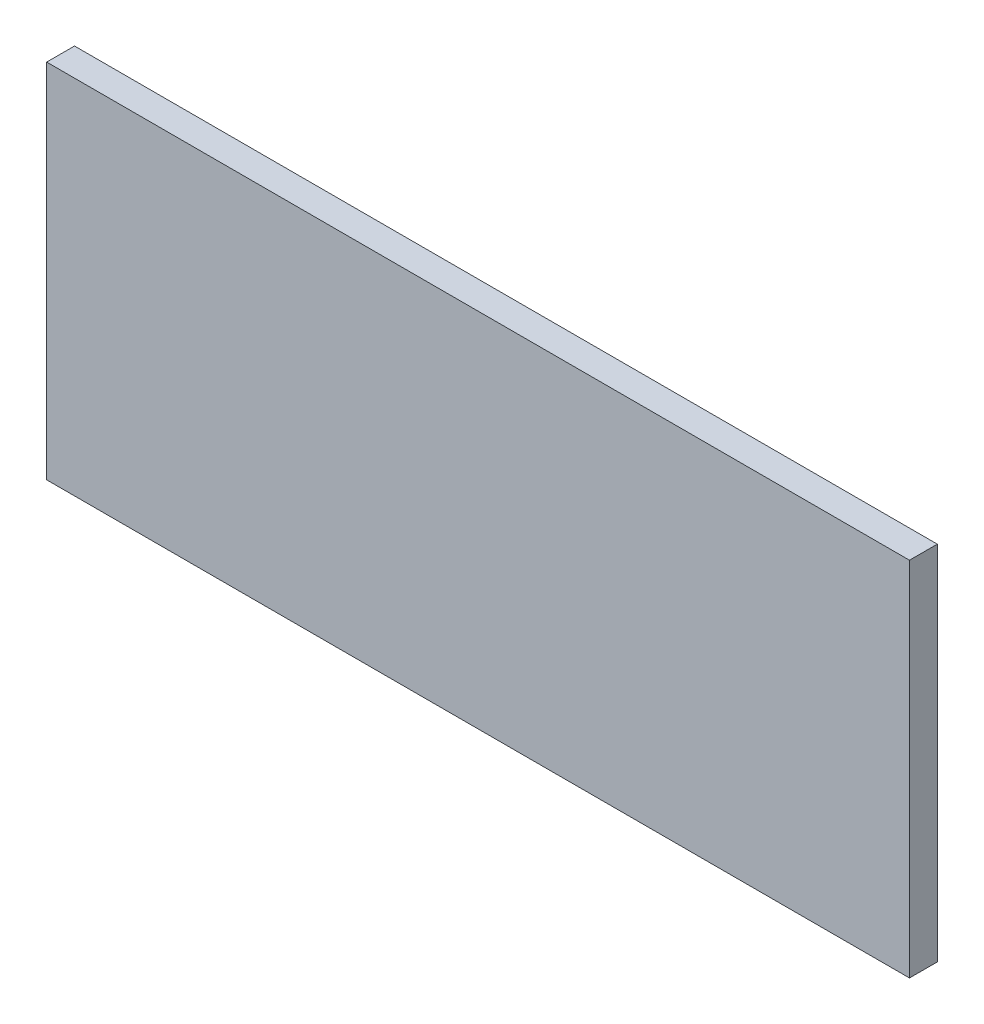
ISO-10303-21;
HEADER;
FILE_DESCRIPTION(('STEP AP214'),'2;1');
FILE_NAME('part.step','',(''),(''),'','','');
FILE_SCHEMA(('AUTOMOTIVE_DESIGN { 1 0 10303 214 1 1 1 1 }'));
ENDSEC;
DATA;
#1=APPLICATION_CONTEXT('core data for automotive mechanical design processes');
#2=APPLICATION_PROTOCOL_DEFINITION('international standard','automotive_design',2000,#1);
#3=PRODUCT_CONTEXT('',#1,'mechanical');
#4=PRODUCT('Part','Part','',(#3));
#5=PRODUCT_RELATED_PRODUCT_CATEGORY('part','',(#4));
#6=PRODUCT_DEFINITION_FORMATION('','',#4);
#7=PRODUCT_DEFINITION_CONTEXT('part definition',#1,'design');
#8=PRODUCT_DEFINITION('design','',#6,#7);
#9=PRODUCT_DEFINITION_SHAPE('','',#8);
#10=(LENGTH_UNIT() NAMED_UNIT(*) SI_UNIT(.MILLI.,.METRE.));
#11=(NAMED_UNIT(*) PLANE_ANGLE_UNIT() SI_UNIT($,.RADIAN.));
#12=(NAMED_UNIT(*) SI_UNIT($,.STERADIAN.) SOLID_ANGLE_UNIT());
#13=UNCERTAINTY_MEASURE_WITH_UNIT(LENGTH_MEASURE(1.E-05),#10,'distance_accuracy_value','');
#14=(GEOMETRIC_REPRESENTATION_CONTEXT(3) GLOBAL_UNCERTAINTY_ASSIGNED_CONTEXT((#13)) GLOBAL_UNIT_ASSIGNED_CONTEXT((#10,
#11,#12)) REPRESENTATION_CONTEXT('',''));
#15=CARTESIAN_POINT('',(0.,0.,0.));
#16=DIRECTION('',(0.,0.,1.));
#17=DIRECTION('',(1.,0.,0.));
#18=AXIS2_PLACEMENT_3D('',#15,#16,#17);
#19=CARTESIAN_POINT('',(310.,-130.,20.));
#20=DIRECTION('',(-1.,0.,0.));
#21=DIRECTION('',(0.,0.,1.));
#22=AXIS2_PLACEMENT_3D('',#19,#20,#21);
#23=PLANE('',#22);
#24=DIRECTION('',(0.,1.,0.));
#25=VECTOR('',#24,1.);
#26=CARTESIAN_POINT('',(310.,-130.,0.));
#27=LINE('',#26,#25);
#28=CARTESIAN_POINT('',(310.,-130.,0.));
#29=VERTEX_POINT('',#28);
#30=CARTESIAN_POINT('',(310.,130.,0.));
#31=VERTEX_POINT('',#30);
#32=EDGE_CURVE('E113',#29,#31,#27,.T.);
#33=ORIENTED_EDGE('',*,*,#32,.T.);
#34=DIRECTION('',(0.,0.,-1.));
#35=VECTOR('',#34,1.);
#36=CARTESIAN_POINT('',(310.,130.,20.));
#37=LINE('',#36,#35);
#38=CARTESIAN_POINT('',(310.,130.,20.));
#39=VERTEX_POINT('',#38);
#40=EDGE_CURVE('E11',#39,#31,#37,.T.);
#41=ORIENTED_EDGE('',*,*,#40,.F.);
#42=DIRECTION('',(0.,1.,0.));
#43=VECTOR('',#42,1.);
#44=CARTESIAN_POINT('',(310.,-130.,20.));
#45=LINE('',#44,#43);
#46=CARTESIAN_POINT('',(310.,-130.,20.));
#47=VERTEX_POINT('',#46);
#48=EDGE_CURVE('E97',#47,#39,#45,.T.);
#49=ORIENTED_EDGE('',*,*,#48,.F.);
#50=DIRECTION('',(0.,0.,-1.));
#51=VECTOR('',#50,1.);
#52=CARTESIAN_POINT('',(310.,-130.,20.));
#53=LINE('',#52,#51);
#54=EDGE_CURVE('E109',#47,#29,#53,.T.);
#55=ORIENTED_EDGE('',*,*,#54,.T.);
#56=EDGE_LOOP('',(#33,#41,#49,#55));
#57=FACE_BOUND('',#56,.T.);
#58=ADVANCED_FACE('F45',(#57),#23,.F.);
#59=CARTESIAN_POINT('',(-310.,130.,20.));
#60=DIRECTION('',(0.,-1.,0.));
#61=DIRECTION('',(0.,0.,-1.));
#62=AXIS2_PLACEMENT_3D('',#59,#60,#61);
#63=PLANE('',#62);
#64=DIRECTION('',(-1.,0.,0.));
#65=VECTOR('',#64,1.);
#66=CARTESIAN_POINT('',(-310.,130.,0.));
#67=LINE('',#66,#65);
#68=CARTESIAN_POINT('',(-310.,130.,0.));
#69=VERTEX_POINT('',#68);
#70=EDGE_CURVE('E102',#31,#69,#67,.T.);
#71=ORIENTED_EDGE('',*,*,#70,.T.);
#72=DIRECTION('',(0.,0.,-1.));
#73=VECTOR('',#72,1.);
#74=CARTESIAN_POINT('',(-310.,130.,20.));
#75=LINE('',#74,#73);
#76=CARTESIAN_POINT('',(-310.,130.,20.));
#77=VERTEX_POINT('',#76);
#78=EDGE_CURVE('E54',#77,#69,#75,.T.);
#79=ORIENTED_EDGE('',*,*,#78,.F.);
#80=DIRECTION('',(-1.,0.,0.));
#81=VECTOR('',#80,1.);
#82=CARTESIAN_POINT('',(-310.,130.,20.));
#83=LINE('',#82,#81);
#84=EDGE_CURVE('E92',#39,#77,#83,.T.);
#85=ORIENTED_EDGE('',*,*,#84,.F.);
#86=ORIENTED_EDGE('',*,*,#40,.T.);
#87=EDGE_LOOP('',(#71,#79,#85,#86));
#88=FACE_BOUND('',#87,.T.);
#89=ADVANCED_FACE('F101',(#88),#63,.F.);
#90=CARTESIAN_POINT('',(-310.,-130.,20.));
#91=DIRECTION('',(1.,0.,0.));
#92=DIRECTION('',(0.,0.,-1.));
#93=AXIS2_PLACEMENT_3D('',#90,#91,#92);
#94=PLANE('',#93);
#95=DIRECTION('',(0.,-1.,0.));
#96=VECTOR('',#95,1.);
#97=CARTESIAN_POINT('',(-310.,-130.,0.));
#98=LINE('',#97,#96);
#99=CARTESIAN_POINT('',(-310.,-130.,0.));
#100=VERTEX_POINT('',#99);
#101=EDGE_CURVE('E79',#69,#100,#98,.T.);
#102=ORIENTED_EDGE('',*,*,#101,.T.);
#103=DIRECTION('',(0.,0.,-1.));
#104=VECTOR('',#103,1.);
#105=CARTESIAN_POINT('',(-310.,-130.,20.));
#106=LINE('',#105,#104);
#107=CARTESIAN_POINT('',(-310.,-130.,20.));
#108=VERTEX_POINT('',#107);
#109=EDGE_CURVE('E104',#108,#100,#106,.T.);
#110=ORIENTED_EDGE('',*,*,#109,.F.);
#111=DIRECTION('',(0.,-1.,0.));
#112=VECTOR('',#111,1.);
#113=CARTESIAN_POINT('',(-310.,-130.,20.));
#114=LINE('',#113,#112);
#115=EDGE_CURVE('E95',#77,#108,#114,.T.);
#116=ORIENTED_EDGE('',*,*,#115,.F.);
#117=ORIENTED_EDGE('',*,*,#78,.T.);
#118=EDGE_LOOP('',(#102,#110,#116,#117));
#119=FACE_BOUND('',#118,.T.);
#120=ADVANCED_FACE('F105',(#119),#94,.F.);
#121=CARTESIAN_POINT('',(-310.,-130.,20.));
#122=DIRECTION('',(0.,1.,0.));
#123=DIRECTION('',(0.,0.,1.));
#124=AXIS2_PLACEMENT_3D('',#121,#122,#123);
#125=PLANE('',#124);
#126=DIRECTION('',(1.,0.,0.));
#127=VECTOR('',#126,1.);
#128=CARTESIAN_POINT('',(-310.,-130.,0.));
#129=LINE('',#128,#127);
#130=EDGE_CURVE('E85',#100,#29,#129,.T.);
#131=ORIENTED_EDGE('',*,*,#130,.T.);
#132=ORIENTED_EDGE('',*,*,#54,.F.);
#133=DIRECTION('',(1.,0.,0.));
#134=VECTOR('',#133,1.);
#135=CARTESIAN_POINT('',(-310.,-130.,20.));
#136=LINE('',#135,#134);
#137=EDGE_CURVE('E62',#108,#47,#136,.T.);
#138=ORIENTED_EDGE('',*,*,#137,.F.);
#139=ORIENTED_EDGE('',*,*,#109,.T.);
#140=EDGE_LOOP('',(#131,#132,#138,#139));
#141=FACE_BOUND('',#140,.T.);
#142=ADVANCED_FACE('F126',(#141),#125,.F.);
#143=CARTESIAN_POINT('',(0.,0.,20.));
#144=DIRECTION('',(0.,0.,-1.));
#145=DIRECTION('',(-1.,0.,0.));
#146=AXIS2_PLACEMENT_3D('',#143,#144,#145);
#147=PLANE('',#146);
#148=ORIENTED_EDGE('',*,*,#48,.T.);
#149=ORIENTED_EDGE('',*,*,#84,.T.);
#150=ORIENTED_EDGE('',*,*,#115,.T.);
#151=ORIENTED_EDGE('',*,*,#137,.T.);
#152=EDGE_LOOP('',(#148,#149,#150,#151));
#153=FACE_BOUND('',#152,.T.);
#154=ADVANCED_FACE('F93',(#153),#147,.F.);
#155=CARTESIAN_POINT('',(0.,0.,0.));
#156=DIRECTION('',(0.,0.,-1.));
#157=DIRECTION('',(-1.,0.,0.));
#158=AXIS2_PLACEMENT_3D('',#155,#156,#157);
#159=PLANE('',#158);
#160=ORIENTED_EDGE('',*,*,#32,.F.);
#161=ORIENTED_EDGE('',*,*,#130,.F.);
#162=ORIENTED_EDGE('',*,*,#101,.F.);
#163=ORIENTED_EDGE('',*,*,#70,.F.);
#164=EDGE_LOOP('',(#160,#161,#162,#163));
#165=FACE_BOUND('',#164,.T.);
#166=ADVANCED_FACE('F129',(#165),#159,.T.);
#167=CLOSED_SHELL('',(#58,#89,#120,#142,#154,#166));
#168=MANIFOLD_SOLID_BREP('B2',#167);
#169=ADVANCED_BREP_SHAPE_REPRESENTATION('',(#18,#168),#14);
#170=SHAPE_DEFINITION_REPRESENTATION(#9,#169);
ENDSEC;
END-ISO-10303-21;
